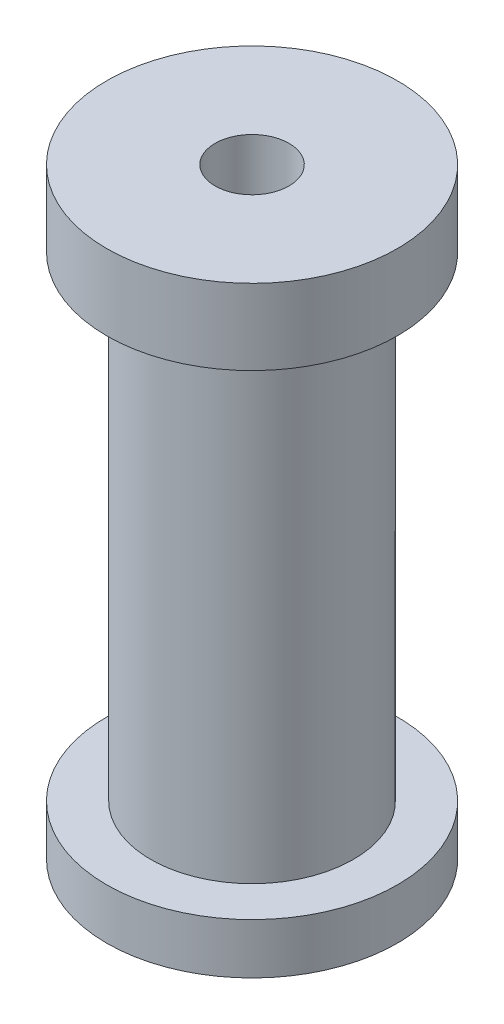
ISO-10303-21;
HEADER;
FILE_DESCRIPTION(('STEP AP214'),'2;1');
FILE_NAME('part.step','',(''),(''),'','','');
FILE_SCHEMA(('AUTOMOTIVE_DESIGN { 1 0 10303 214 1 1 1 1 }'));
ENDSEC;
DATA;
#1=APPLICATION_CONTEXT('core data for automotive mechanical design processes');
#2=APPLICATION_PROTOCOL_DEFINITION('international standard','automotive_design',2000,#1);
#3=PRODUCT_CONTEXT('',#1,'mechanical');
#4=PRODUCT('Part','Part','',(#3));
#5=PRODUCT_RELATED_PRODUCT_CATEGORY('part','',(#4));
#6=PRODUCT_DEFINITION_FORMATION('','',#4);
#7=PRODUCT_DEFINITION_CONTEXT('part definition',#1,'design');
#8=PRODUCT_DEFINITION('design','',#6,#7);
#9=PRODUCT_DEFINITION_SHAPE('','',#8);
#10=(LENGTH_UNIT() NAMED_UNIT(*) SI_UNIT(.MILLI.,.METRE.));
#11=(NAMED_UNIT(*) PLANE_ANGLE_UNIT() SI_UNIT($,.RADIAN.));
#12=(NAMED_UNIT(*) SI_UNIT($,.STERADIAN.) SOLID_ANGLE_UNIT());
#13=UNCERTAINTY_MEASURE_WITH_UNIT(LENGTH_MEASURE(1.E-05),#10,'distance_accuracy_value','');
#14=(GEOMETRIC_REPRESENTATION_CONTEXT(3) GLOBAL_UNCERTAINTY_ASSIGNED_CONTEXT((#13)) GLOBAL_UNIT_ASSIGNED_CONTEXT((#10,
#11,#12)) REPRESENTATION_CONTEXT('',''));
#15=CARTESIAN_POINT('',(0.,0.,0.));
#16=DIRECTION('',(0.,0.,1.));
#17=DIRECTION('',(1.,0.,0.));
#18=AXIS2_PLACEMENT_3D('',#15,#16,#17);
#19=CARTESIAN_POINT('',(0.,4.6736,0.));
#20=DIRECTION('',(0.,1.,0.));
#21=DIRECTION('',(0.,0.,1.));
#22=AXIS2_PLACEMENT_3D('',#19,#20,#21);
#23=PLANE('',#22);
#24=CARTESIAN_POINT('',(0.,4.6736,0.));
#25=DIRECTION('',(0.,1.,0.));
#26=DIRECTION('',(0.,0.,1.));
#27=AXIS2_PLACEMENT_3D('',#24,#25,#26);
#28=CIRCLE('',#27,13.4366);
#29=CARTESIAN_POINT('',(0.,4.6736,13.4366));
#30=VERTEX_POINT('',#29);
#31=EDGE_CURVE('E10',#30,#30,#28,.T.);
#32=ORIENTED_EDGE('',*,*,#31,.T.);
#33=EDGE_LOOP('',(#32));
#34=FACE_BOUND('',#33,.T.);
#35=CARTESIAN_POINT('',(0.,4.6736,0.));
#36=DIRECTION('',(0.,1.,0.));
#37=DIRECTION('',(0.,0.,1.));
#38=AXIS2_PLACEMENT_3D('',#35,#36,#37);
#39=CIRCLE('',#38,9.3726);
#40=CARTESIAN_POINT('',(0.,4.67359999999999,-9.3726));
#41=VERTEX_POINT('',#40);
#42=EDGE_CURVE('E47',#41,#41,#39,.T.);
#43=ORIENTED_EDGE('',*,*,#42,.F.);
#44=EDGE_LOOP('',(#43));
#45=FACE_BOUND('',#44,.T.);
#46=ADVANCED_FACE('F34',(#34,#45),#23,.T.);
#47=CARTESIAN_POINT('',(0.,4.6736,0.));
#48=DIRECTION('',(0.,-1.,0.));
#49=DIRECTION('',(0.,0.,-1.));
#50=AXIS2_PLACEMENT_3D('',#47,#48,#49);
#51=CYLINDRICAL_SURFACE('',#50,13.4366);
#52=ORIENTED_EDGE('',*,*,#31,.F.);
#53=EDGE_LOOP('',(#52));
#54=FACE_BOUND('',#53,.T.);
#55=CARTESIAN_POINT('',(0.,0.,0.));
#56=DIRECTION('',(0.,1.,0.));
#57=DIRECTION('',(0.,0.,1.));
#58=AXIS2_PLACEMENT_3D('',#55,#56,#57);
#59=CIRCLE('',#58,13.4366);
#60=CARTESIAN_POINT('',(0.,0.,13.4366));
#61=VERTEX_POINT('',#60);
#62=EDGE_CURVE('E38',#61,#61,#59,.T.);
#63=ORIENTED_EDGE('',*,*,#62,.T.);
#64=EDGE_LOOP('',(#63));
#65=FACE_BOUND('',#64,.T.);
#66=ADVANCED_FACE('F36',(#54,#65),#51,.T.);
#67=CARTESIAN_POINT('',(0.,0.,0.));
#68=DIRECTION('',(0.,1.,0.));
#69=DIRECTION('',(0.,0.,1.));
#70=AXIS2_PLACEMENT_3D('',#67,#68,#69);
#71=PLANE('',#70);
#72=CARTESIAN_POINT('',(0.,0.,0.));
#73=DIRECTION('',(0.,-1.,0.));
#74=DIRECTION('',(0.,0.,-1.));
#75=AXIS2_PLACEMENT_3D('',#72,#73,#74);
#76=CIRCLE('',#75,3.4163);
#77=CARTESIAN_POINT('',(0.,0.,-3.4163));
#78=VERTEX_POINT('',#77);
#79=EDGE_CURVE('E59',#78,#78,#76,.T.);
#80=ORIENTED_EDGE('',*,*,#79,.F.);
#81=EDGE_LOOP('',(#80));
#82=FACE_BOUND('',#81,.T.);
#83=ORIENTED_EDGE('',*,*,#62,.F.);
#84=EDGE_LOOP('',(#83));
#85=FACE_BOUND('',#84,.T.);
#86=ADVANCED_FACE('F74',(#82,#85),#71,.F.);
#87=CARTESIAN_POINT('',(0.,48.6156,0.));
#88=DIRECTION('',(0.,-1.,0.));
#89=DIRECTION('',(0.,0.,-1.));
#90=AXIS2_PLACEMENT_3D('',#87,#88,#89);
#91=CYLINDRICAL_SURFACE('',#90,9.3726);
#92=CARTESIAN_POINT('',(0.,48.6156,0.));
#93=DIRECTION('',(0.,1.,0.));
#94=DIRECTION('',(0.,0.,1.));
#95=AXIS2_PLACEMENT_3D('',#92,#93,#94);
#96=CIRCLE('',#95,9.3726);
#97=CARTESIAN_POINT('',(0.,48.6156,-9.3726));
#98=VERTEX_POINT('',#97);
#99=EDGE_CURVE('E45',#98,#98,#96,.T.);
#100=CARTESIAN_POINT('',(0.,48.6156,-9.3726));
#101=CARTESIAN_POINT('',(0.,48.1578708333333,-9.3726));
#102=CARTESIAN_POINT('',(0.,47.7001416666667,-9.3726));
#103=CARTESIAN_POINT('',(0.,46.7846833333333,-9.3726));
#104=CARTESIAN_POINT('',(0.,46.3269541666667,-9.3726));
#105=CARTESIAN_POINT('',(0.,45.4114958333333,-9.3726));
#106=CARTESIAN_POINT('',(0.,44.9537666666667,-9.3726));
#107=CARTESIAN_POINT('',(0.,44.0383083333333,-9.3726));
#108=CARTESIAN_POINT('',(0.,43.5805791666667,-9.3726));
#109=CARTESIAN_POINT('',(0.,42.6651208333333,-9.3726));
#110=CARTESIAN_POINT('',(0.,42.2073916666667,-9.3726));
#111=CARTESIAN_POINT('',(0.,41.2919333333333,-9.3726));
#112=CARTESIAN_POINT('',(0.,40.8342041666667,-9.3726));
#113=CARTESIAN_POINT('',(0.,39.9187458333333,-9.3726));
#114=CARTESIAN_POINT('',(0.,39.4610166666667,-9.3726));
#115=CARTESIAN_POINT('',(0.,38.5455583333333,-9.3726));
#116=CARTESIAN_POINT('',(0.,38.0878291666667,-9.3726));
#117=CARTESIAN_POINT('',(0.,37.1723708333333,-9.3726));
#118=CARTESIAN_POINT('',(0.,36.7146416666667,-9.3726));
#119=CARTESIAN_POINT('',(0.,35.7991833333333,-9.3726));
#120=CARTESIAN_POINT('',(0.,35.3414541666667,-9.3726));
#121=CARTESIAN_POINT('',(0.,34.4259958333333,-9.3726));
#122=CARTESIAN_POINT('',(0.,33.9682666666667,-9.3726));
#123=CARTESIAN_POINT('',(0.,33.0528083333333,-9.3726));
#124=CARTESIAN_POINT('',(0.,32.5950791666667,-9.3726));
#125=CARTESIAN_POINT('',(0.,31.6796208333333,-9.3726));
#126=CARTESIAN_POINT('',(0.,31.2218916666667,-9.3726));
#127=CARTESIAN_POINT('',(0.,30.3064333333333,-9.3726));
#128=CARTESIAN_POINT('',(0.,29.8487041666667,-9.3726));
#129=CARTESIAN_POINT('',(0.,28.9332458333333,-9.3726));
#130=CARTESIAN_POINT('',(0.,28.4755166666667,-9.3726));
#131=CARTESIAN_POINT('',(0.,27.5600583333333,-9.3726));
#132=CARTESIAN_POINT('',(0.,27.1023291666667,-9.3726));
#133=CARTESIAN_POINT('',(0.,26.1868708333333,-9.3726));
#134=CARTESIAN_POINT('',(0.,25.7291416666667,-9.3726));
#135=CARTESIAN_POINT('',(0.,24.8136833333333,-9.3726));
#136=CARTESIAN_POINT('',(0.,24.3559541666667,-9.3726));
#137=CARTESIAN_POINT('',(0.,23.4404958333333,-9.3726));
#138=CARTESIAN_POINT('',(0.,22.9827666666667,-9.3726));
#139=CARTESIAN_POINT('',(0.,22.0673083333333,-9.3726));
#140=CARTESIAN_POINT('',(0.,21.6095791666667,-9.3726));
#141=CARTESIAN_POINT('',(0.,20.6941208333333,-9.3726));
#142=CARTESIAN_POINT('',(0.,20.2363916666667,-9.3726));
#143=CARTESIAN_POINT('',(0.,19.3209333333333,-9.3726));
#144=CARTESIAN_POINT('',(0.,18.8632041666667,-9.3726));
#145=CARTESIAN_POINT('',(0.,17.9477458333333,-9.3726));
#146=CARTESIAN_POINT('',(0.,17.4900166666667,-9.3726));
#147=CARTESIAN_POINT('',(0.,16.5745583333333,-9.3726));
#148=CARTESIAN_POINT('',(0.,16.1168291666667,-9.3726));
#149=CARTESIAN_POINT('',(0.,15.2013708333333,-9.3726));
#150=CARTESIAN_POINT('',(0.,14.7436416666667,-9.3726));
#151=CARTESIAN_POINT('',(0.,13.8281833333333,-9.3726));
#152=CARTESIAN_POINT('',(0.,13.3704541666667,-9.3726));
#153=CARTESIAN_POINT('',(0.,12.4549958333333,-9.3726));
#154=CARTESIAN_POINT('',(0.,11.9972666666667,-9.3726));
#155=CARTESIAN_POINT('',(0.,11.0818083333333,-9.3726));
#156=CARTESIAN_POINT('',(0.,10.6240791666667,-9.3726));
#157=CARTESIAN_POINT('',(0.,9.70862083333333,-9.3726));
#158=CARTESIAN_POINT('',(0.,9.25089166666666,-9.3726));
#159=CARTESIAN_POINT('',(0.,8.33543333333333,-9.3726));
#160=CARTESIAN_POINT('',(0.,7.87770416666666,-9.3726));
#161=CARTESIAN_POINT('',(0.,6.96224583333333,-9.3726));
#162=CARTESIAN_POINT('',(0.,6.50451666666666,-9.3726));
#163=CARTESIAN_POINT('',(0.,5.58905833333332,-9.3726));
#164=CARTESIAN_POINT('',(0.,5.13132916666666,-9.3726));
#165=CARTESIAN_POINT('',(0.,4.67359999999999,-9.3726));
#166=B_SPLINE_CURVE_WITH_KNOTS('',3,(#100,#101,#102,#103,#104,#105,#106,#107,#108,#109,#110,
#111,#112,#113,#114,#115,#116,#117,#118,#119,#120,#121,#122,#123,#124,#125,#126,#127,#128,#129,
#130,#131,#132,#133,#134,#135,#136,#137,#138,#139,#140,#141,#142,#143,#144,#145,#146,#147,#148,
#149,#150,#151,#152,#153,#154,#155,#156,#157,#158,#159,#160,#161,#162,#163,#164,#165),
.UNSPECIFIED.,.F.,.F.,(4,2,2,2,2,2,2,2,2,2,2,2,2,2,2,2,2,2,2,2,2,2,2,2,2,2,2,2,2,2,2,2,4),(0.,
1.3731875,2.746375,4.11956249999999,5.49275,6.86593749999999,8.23912499999999,9.6123125,10.9855,
12.3586875,13.731875,15.1050625,16.47825,17.8514375,19.224625,20.5978125,21.971,23.3441875,
24.717375,26.0905625,27.46375,28.8369375,30.210125,31.5833125,32.9565,34.3296875,35.702875,
37.0760625,38.44925,39.8224375,41.195625,42.5688125,43.942),.UNSPECIFIED.);
#167=EDGE_CURVE('BSEAM77',#98,#41,#166,.T.);
#168=ORIENTED_EDGE('',*,*,#99,.F.);
#169=ORIENTED_EDGE('',*,*,#42,.T.);
#170=ORIENTED_EDGE('',*,*,#167,.T.);
#171=ORIENTED_EDGE('',*,*,#167,.F.);
#172=EDGE_LOOP('',(#168,#170,#169,#171));
#173=FACE_BOUND('',#172,.T.);
#174=ADVANCED_FACE('F77',(#173),#91,.T.);
#175=CARTESIAN_POINT('',(0.,48.6156,0.));
#176=DIRECTION('',(0.,1.,0.));
#177=DIRECTION('',(0.,0.,1.));
#178=AXIS2_PLACEMENT_3D('',#175,#176,#177);
#179=PLANE('',#178);
#180=CARTESIAN_POINT('',(0.,48.6156,0.));
#181=DIRECTION('',(0.,1.,0.));
#182=DIRECTION('',(0.,0.,1.));
#183=AXIS2_PLACEMENT_3D('',#180,#181,#182);
#184=CIRCLE('',#183,13.4366);
#185=CARTESIAN_POINT('',(0.,48.6156,13.4366));
#186=VERTEX_POINT('',#185);
#187=EDGE_CURVE('E53',#186,#186,#184,.T.);
#188=ORIENTED_EDGE('',*,*,#187,.F.);
#189=EDGE_LOOP('',(#188));
#190=FACE_BOUND('',#189,.T.);
#191=ORIENTED_EDGE('',*,*,#99,.T.);
#192=EDGE_LOOP('',(#191));
#193=FACE_BOUND('',#192,.T.);
#194=ADVANCED_FACE('F93',(#190,#193),#179,.F.);
#195=CARTESIAN_POINT('',(0.,55.6006,0.));
#196=DIRECTION('',(0.,-1.,0.));
#197=DIRECTION('',(0.,0.,-1.));
#198=AXIS2_PLACEMENT_3D('',#195,#196,#197);
#199=CYLINDRICAL_SURFACE('',#198,13.4366);
#200=CARTESIAN_POINT('',(0.,55.6006,0.));
#201=DIRECTION('',(0.,1.,0.));
#202=DIRECTION('',(0.,0.,1.));
#203=AXIS2_PLACEMENT_3D('',#200,#201,#202);
#204=CIRCLE('',#203,13.4366);
#205=CARTESIAN_POINT('',(0.,55.6006,13.4366));
#206=VERTEX_POINT('',#205);
#207=EDGE_CURVE('E50',#206,#206,#204,.T.);
#208=ORIENTED_EDGE('',*,*,#207,.F.);
#209=EDGE_LOOP('',(#208));
#210=FACE_BOUND('',#209,.T.);
#211=ORIENTED_EDGE('',*,*,#187,.T.);
#212=EDGE_LOOP('',(#211));
#213=FACE_BOUND('',#212,.T.);
#214=ADVANCED_FACE('F95',(#210,#213),#199,.T.);
#215=CARTESIAN_POINT('',(0.,55.6006,0.));
#216=DIRECTION('',(0.,1.,0.));
#217=DIRECTION('',(0.,0.,1.));
#218=AXIS2_PLACEMENT_3D('',#215,#216,#217);
#219=PLANE('',#218);
#220=CARTESIAN_POINT('',(0.,55.6006,0.));
#221=DIRECTION('',(0.,-1.,0.));
#222=DIRECTION('',(0.,0.,-1.));
#223=AXIS2_PLACEMENT_3D('',#220,#221,#222);
#224=CIRCLE('',#223,3.4163);
#225=CARTESIAN_POINT('',(0.,55.6006,-3.4163));
#226=VERTEX_POINT('',#225);
#227=EDGE_CURVE('E56',#226,#226,#224,.T.);
#228=ORIENTED_EDGE('',*,*,#227,.T.);
#229=EDGE_LOOP('',(#228));
#230=FACE_BOUND('',#229,.T.);
#231=ORIENTED_EDGE('',*,*,#207,.T.);
#232=EDGE_LOOP('',(#231));
#233=FACE_BOUND('',#232,.T.);
#234=ADVANCED_FACE('F65',(#230,#233),#219,.T.);
#235=CARTESIAN_POINT('',(0.,55.6006,0.));
#236=DIRECTION('',(0.,-1.,0.));
#237=DIRECTION('',(0.,0.,-1.));
#238=AXIS2_PLACEMENT_3D('',#235,#236,#237);
#239=CYLINDRICAL_SURFACE('',#238,3.4163);
#240=ORIENTED_EDGE('',*,*,#227,.F.);
#241=EDGE_LOOP('',(#240));
#242=FACE_BOUND('',#241,.T.);
#243=ORIENTED_EDGE('',*,*,#79,.T.);
#244=EDGE_LOOP('',(#243));
#245=FACE_BOUND('',#244,.T.);
#246=ADVANCED_FACE('F68',(#242,#245),#239,.F.);
#247=CLOSED_SHELL('',(#46,#66,#86,#174,#194,#214,#234,#246));
#248=MANIFOLD_SOLID_BREP('B2',#247);
#249=ADVANCED_BREP_SHAPE_REPRESENTATION('',(#18,#248),#14);
#250=SHAPE_DEFINITION_REPRESENTATION(#9,#249);
ENDSEC;
END-ISO-10303-21;
